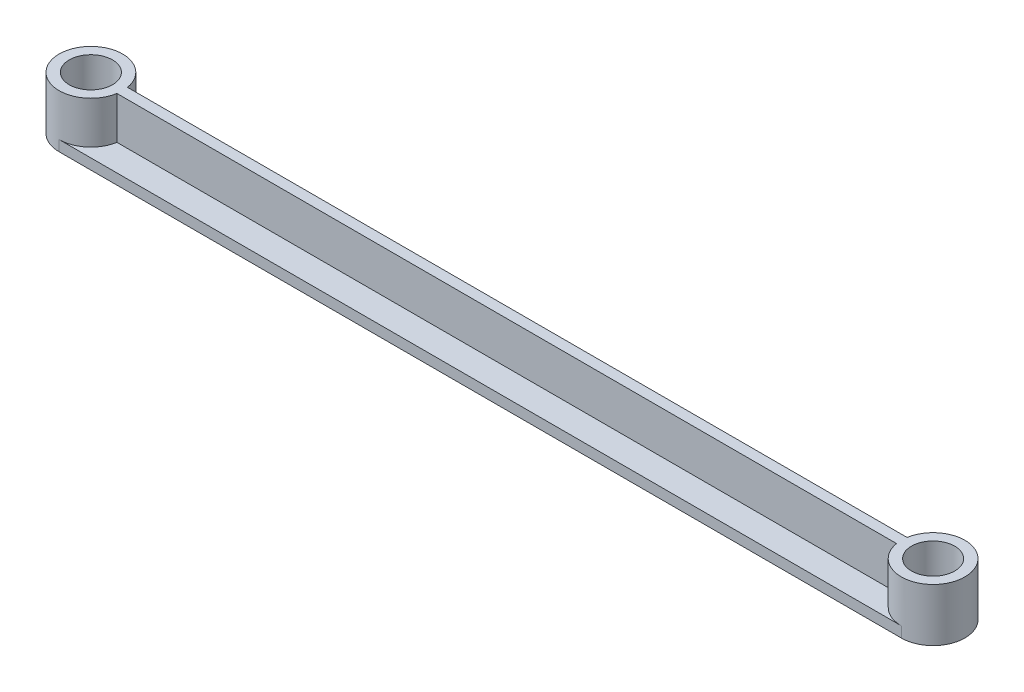
ISO-10303-21;
HEADER;
FILE_DESCRIPTION(('STEP AP214'),'2;1');
FILE_NAME('part.step','',(''),(''),'','','');
FILE_SCHEMA(('AUTOMOTIVE_DESIGN { 1 0 10303 214 1 1 1 1 }'));
ENDSEC;
DATA;
#1=APPLICATION_CONTEXT('core data for automotive mechanical design processes');
#2=APPLICATION_PROTOCOL_DEFINITION('international standard','automotive_design',2000,#1);
#3=PRODUCT_CONTEXT('',#1,'mechanical');
#4=PRODUCT('Part','Part','',(#3));
#5=PRODUCT_RELATED_PRODUCT_CATEGORY('part','',(#4));
#6=PRODUCT_DEFINITION_FORMATION('','',#4);
#7=PRODUCT_DEFINITION_CONTEXT('part definition',#1,'design');
#8=PRODUCT_DEFINITION('design','',#6,#7);
#9=PRODUCT_DEFINITION_SHAPE('','',#8);
#10=(LENGTH_UNIT() NAMED_UNIT(*) SI_UNIT(.MILLI.,.METRE.));
#11=(NAMED_UNIT(*) PLANE_ANGLE_UNIT() SI_UNIT($,.RADIAN.));
#12=(NAMED_UNIT(*) SI_UNIT($,.STERADIAN.) SOLID_ANGLE_UNIT());
#13=UNCERTAINTY_MEASURE_WITH_UNIT(LENGTH_MEASURE(1.E-05),#10,'distance_accuracy_value','');
#14=(GEOMETRIC_REPRESENTATION_CONTEXT(3) GLOBAL_UNCERTAINTY_ASSIGNED_CONTEXT((#13)) GLOBAL_UNIT_ASSIGNED_CONTEXT((#10,
#11,#12)) REPRESENTATION_CONTEXT('',''));
#15=CARTESIAN_POINT('',(0.,0.,0.));
#16=DIRECTION('',(0.,0.,1.));
#17=DIRECTION('',(1.,0.,0.));
#18=AXIS2_PLACEMENT_3D('',#15,#16,#17);
#19=CARTESIAN_POINT('',(0.,1.5875,0.));
#20=DIRECTION('',(0.,1.,0.));
#21=DIRECTION('',(0.,0.,1.));
#22=AXIS2_PLACEMENT_3D('',#19,#20,#21);
#23=PLANE('',#22);
#24=DIRECTION('',(1.,0.,0.));
#25=VECTOR('',#24,1.);
#26=CARTESIAN_POINT('',(-131.0152,1.5875,-0.793750000000001));
#27=LINE('',#26,#25);
#28=CARTESIAN_POINT('',(-121.554811672165,1.5875,-0.793750000000001));
#29=VERTEX_POINT('',#28);
#30=CARTESIAN_POINT('',(-4.69588832783533,1.5875,-0.793750000000001));
#31=VERTEX_POINT('',#30);
#32=EDGE_CURVE('E131',#29,#31,#27,.T.);
#33=ORIENTED_EDGE('',*,*,#32,.T.);
#34=CARTESIAN_POINT('',(0.,1.5875,0.));
#35=DIRECTION('',(0.,1.,0.));
#36=DIRECTION('',(0.,0.,1.));
#37=AXIS2_PLACEMENT_3D('',#34,#35,#36);
#38=CIRCLE('',#37,4.7625);
#39=CARTESIAN_POINT('',(0.,1.5875,-4.7625));
#40=VERTEX_POINT('',#39);
#41=EDGE_CURVE('E45',#31,#40,#38,.F.);
#42=ORIENTED_EDGE('',*,*,#41,.T.);
#43=DIRECTION('',(-1.,0.,0.));
#44=VECTOR('',#43,1.);
#45=CARTESIAN_POINT('',(0.,1.5875,-4.7625));
#46=LINE('',#45,#44);
#47=CARTESIAN_POINT('',(-126.2507,1.5875,-4.76249999999998));
#48=VERTEX_POINT('',#47);
#49=EDGE_CURVE('E90',#40,#48,#46,.T.);
#50=ORIENTED_EDGE('',*,*,#49,.T.);
#51=CARTESIAN_POINT('',(-126.2507,1.5875,0.));
#52=DIRECTION('',(0.,1.,0.));
#53=DIRECTION('',(0.,0.,1.));
#54=AXIS2_PLACEMENT_3D('',#51,#52,#53);
#55=CIRCLE('',#54,4.7625);
#56=EDGE_CURVE('E139',#29,#48,#55,.T.);
#57=ORIENTED_EDGE('',*,*,#56,.F.);
#58=EDGE_LOOP('',(#33,#42,#50,#57));
#59=FACE_BOUND('',#58,.T.);
#60=ADVANCED_FACE('F37',(#59),#23,.T.);
#61=CARTESIAN_POINT('',(0.,1.5875,0.));
#62=DIRECTION('',(0.,-1.,0.));
#63=DIRECTION('',(0.,0.,-1.));
#64=AXIS2_PLACEMENT_3D('',#61,#62,#63);
#65=CYLINDRICAL_SURFACE('',#64,4.7625);
#66=ORIENTED_EDGE('',*,*,#41,.F.);
#67=DIRECTION('',(0.,-1.,0.));
#68=VECTOR('',#67,1.);
#69=CARTESIAN_POINT('',(-4.69588832783533,1.5875,-0.793750000000001));
#70=LINE('',#69,#68);
#71=CARTESIAN_POINT('',(-4.69588832783533,7.9375,-0.793749999999999));
#72=VERTEX_POINT('',#71);
#73=EDGE_CURVE('E167',#31,#72,#70,.F.);
#74=ORIENTED_EDGE('',*,*,#73,.T.);
#75=CARTESIAN_POINT('',(0.,7.9375,0.));
#76=DIRECTION('',(0.,1.,0.));
#77=DIRECTION('',(0.,0.,1.));
#78=AXIS2_PLACEMENT_3D('',#75,#76,#77);
#79=CIRCLE('',#78,4.7625);
#80=CARTESIAN_POINT('',(-4.69588832783532,7.9375,0.793749999999998));
#81=VERTEX_POINT('',#80);
#82=EDGE_CURVE('E150',#81,#72,#79,.T.);
#83=ORIENTED_EDGE('',*,*,#82,.F.);
#84=DIRECTION('',(0.,-1.,0.));
#85=VECTOR('',#84,1.);
#86=CARTESIAN_POINT('',(-4.69588832783533,1.5875,0.793750000000001));
#87=LINE('',#86,#85);
#88=CARTESIAN_POINT('',(-4.69588832783533,1.5875,0.793750000000001));
#89=VERTEX_POINT('',#88);
#90=EDGE_CURVE('E52',#81,#89,#87,.T.);
#91=ORIENTED_EDGE('',*,*,#90,.T.);
#92=CARTESIAN_POINT('',(0.,1.5875,4.7625));
#93=VERTEX_POINT('',#92);
#94=EDGE_CURVE('E11',#93,#89,#38,.F.);
#95=ORIENTED_EDGE('',*,*,#94,.F.);
#96=DIRECTION('',(0.,-1.,0.));
#97=VECTOR('',#96,1.);
#98=CARTESIAN_POINT('',(0.,1.5875,4.7625));
#99=LINE('',#98,#97);
#100=CARTESIAN_POINT('',(0.,0.,4.7625));
#101=VERTEX_POINT('',#100);
#102=EDGE_CURVE('E83',#93,#101,#99,.T.);
#103=ORIENTED_EDGE('',*,*,#102,.T.);
#104=CARTESIAN_POINT('',(0.,0.,0.));
#105=DIRECTION('',(0.,1.,0.));
#106=DIRECTION('',(0.,0.,1.));
#107=AXIS2_PLACEMENT_3D('',#104,#105,#106);
#108=CIRCLE('',#107,4.7625);
#109=CARTESIAN_POINT('',(0.,0.,-4.7625));
#110=VERTEX_POINT('',#109);
#111=EDGE_CURVE('E97',#101,#110,#108,.T.);
#112=ORIENTED_EDGE('',*,*,#111,.T.);
#113=DIRECTION('',(0.,-1.,0.));
#114=VECTOR('',#113,1.);
#115=CARTESIAN_POINT('',(0.,1.5875,-4.7625));
#116=LINE('',#115,#114);
#117=EDGE_CURVE('E116',#40,#110,#116,.T.);
#118=ORIENTED_EDGE('',*,*,#117,.F.);
#119=EDGE_LOOP('',(#66,#74,#83,#91,#95,#103,#112,#118));
#120=FACE_BOUND('',#119,.T.);
#121=ADVANCED_FACE('F39',(#120),#65,.T.);
#122=CARTESIAN_POINT('',(0.,1.5875,-4.7625));
#123=DIRECTION('',(0.,0.,1.));
#124=DIRECTION('',(1.,0.,0.));
#125=AXIS2_PLACEMENT_3D('',#122,#123,#124);
#126=PLANE('',#125);
#127=DIRECTION('',(-1.,0.,0.));
#128=VECTOR('',#127,1.);
#129=CARTESIAN_POINT('',(0.,0.,-4.7625));
#130=LINE('',#129,#128);
#131=CARTESIAN_POINT('',(-126.2507,0.,-4.76249999999998));
#132=VERTEX_POINT('',#131);
#133=EDGE_CURVE('E100',#110,#132,#130,.T.);
#134=ORIENTED_EDGE('',*,*,#133,.T.);
#135=DIRECTION('',(0.,-1.,0.));
#136=VECTOR('',#135,1.);
#137=CARTESIAN_POINT('',(-126.2507,1.5875,-4.76249999999998));
#138=LINE('',#137,#136);
#139=EDGE_CURVE('E113',#48,#132,#138,.T.);
#140=ORIENTED_EDGE('',*,*,#139,.F.);
#141=ORIENTED_EDGE('',*,*,#49,.F.);
#142=ORIENTED_EDGE('',*,*,#117,.T.);
#143=EDGE_LOOP('',(#134,#140,#141,#142));
#144=FACE_BOUND('',#143,.T.);
#145=ADVANCED_FACE('F136',(#144),#126,.F.);
#146=CARTESIAN_POINT('',(-126.2507,1.5875,0.));
#147=DIRECTION('',(0.,-1.,0.));
#148=DIRECTION('',(0.,0.,-1.));
#149=AXIS2_PLACEMENT_3D('',#146,#147,#148);
#150=CYLINDRICAL_SURFACE('',#149,4.7625);
#151=CARTESIAN_POINT('',(-126.2507,7.9375,0.));
#152=DIRECTION('',(0.,1.,0.));
#153=DIRECTION('',(0.,0.,1.));
#154=AXIS2_PLACEMENT_3D('',#151,#152,#153);
#155=CIRCLE('',#154,4.7625);
#156=CARTESIAN_POINT('',(-121.554811672165,7.9375,-0.79375));
#157=VERTEX_POINT('',#156);
#158=CARTESIAN_POINT('',(-121.554811672165,7.9375,0.79375));
#159=VERTEX_POINT('',#158);
#160=EDGE_CURVE('E102',#157,#159,#155,.T.);
#161=ORIENTED_EDGE('',*,*,#160,.F.);
#162=DIRECTION('',(0.,-1.,0.));
#163=VECTOR('',#162,1.);
#164=CARTESIAN_POINT('',(-121.554811672165,1.5875,-0.793750000000001));
#165=LINE('',#164,#163);
#166=EDGE_CURVE('E156',#29,#157,#165,.F.);
#167=ORIENTED_EDGE('',*,*,#166,.F.);
#168=ORIENTED_EDGE('',*,*,#56,.T.);
#169=ORIENTED_EDGE('',*,*,#139,.T.);
#170=CARTESIAN_POINT('',(-126.2507,0.,0.));
#171=DIRECTION('',(0.,1.,0.));
#172=DIRECTION('',(0.,0.,1.));
#173=AXIS2_PLACEMENT_3D('',#170,#171,#172);
#174=CIRCLE('',#173,4.7625);
#175=CARTESIAN_POINT('',(-126.2507,0.,4.76250000000002));
#176=VERTEX_POINT('',#175);
#177=EDGE_CURVE('E91',#132,#176,#174,.T.);
#178=ORIENTED_EDGE('',*,*,#177,.T.);
#179=DIRECTION('',(0.,-1.,0.));
#180=VECTOR('',#179,1.);
#181=CARTESIAN_POINT('',(-126.2507,1.5875,4.76250000000002));
#182=LINE('',#181,#180);
#183=CARTESIAN_POINT('',(-126.2507,1.5875,4.76250000000001));
#184=VERTEX_POINT('',#183);
#185=EDGE_CURVE('E86',#184,#176,#182,.T.);
#186=ORIENTED_EDGE('',*,*,#185,.F.);
#187=CARTESIAN_POINT('',(-121.554811672165,1.5875,0.793750000000001));
#188=VERTEX_POINT('',#187);
#189=EDGE_CURVE('E106',#184,#188,#55,.T.);
#190=ORIENTED_EDGE('',*,*,#189,.T.);
#191=DIRECTION('',(0.,-1.,0.));
#192=VECTOR('',#191,1.);
#193=CARTESIAN_POINT('',(-121.554811672165,1.5875,0.793750000000001));
#194=LINE('',#193,#192);
#195=EDGE_CURVE('E164',#159,#188,#194,.T.);
#196=ORIENTED_EDGE('',*,*,#195,.F.);
#197=EDGE_LOOP('',(#161,#167,#168,#169,#178,#186,#190,#196));
#198=FACE_BOUND('',#197,.T.);
#199=ADVANCED_FACE('F180',(#198),#150,.T.);
#200=CARTESIAN_POINT('',(0.,1.5875,4.7625));
#201=DIRECTION('',(0.,0.,-1.));
#202=DIRECTION('',(-1.,0.,0.));
#203=AXIS2_PLACEMENT_3D('',#200,#201,#202);
#204=PLANE('',#203);
#205=DIRECTION('',(1.,0.,0.));
#206=VECTOR('',#205,1.);
#207=CARTESIAN_POINT('',(0.,0.,4.7625));
#208=LINE('',#207,#206);
#209=EDGE_CURVE('E80',#176,#101,#208,.T.);
#210=ORIENTED_EDGE('',*,*,#209,.T.);
#211=ORIENTED_EDGE('',*,*,#102,.F.);
#212=DIRECTION('',(1.,0.,0.));
#213=VECTOR('',#212,1.);
#214=CARTESIAN_POINT('',(0.,1.5875,4.7625));
#215=LINE('',#214,#213);
#216=EDGE_CURVE('E60',#184,#93,#215,.T.);
#217=ORIENTED_EDGE('',*,*,#216,.F.);
#218=ORIENTED_EDGE('',*,*,#185,.T.);
#219=EDGE_LOOP('',(#210,#211,#217,#218));
#220=FACE_BOUND('',#219,.T.);
#221=ADVANCED_FACE('F82',(#220),#204,.F.);
#222=DIRECTION('',(1.,0.,0.));
#223=VECTOR('',#222,1.);
#224=CARTESIAN_POINT('',(-131.0152,1.5875,0.793750000000001));
#225=LINE('',#224,#223);
#226=EDGE_CURVE('E154',#188,#89,#225,.T.);
#227=ORIENTED_EDGE('',*,*,#226,.F.);
#228=ORIENTED_EDGE('',*,*,#189,.F.);
#229=ORIENTED_EDGE('',*,*,#216,.T.);
#230=ORIENTED_EDGE('',*,*,#94,.T.);
#231=EDGE_LOOP('',(#227,#228,#229,#230));
#232=FACE_BOUND('',#231,.T.);
#233=ADVANCED_FACE('F174',(#232),#23,.T.);
#234=CARTESIAN_POINT('',(0.,0.,0.));
#235=DIRECTION('',(0.,1.,0.));
#236=DIRECTION('',(0.,0.,1.));
#237=AXIS2_PLACEMENT_3D('',#234,#235,#236);
#238=PLANE('',#237);
#239=ORIENTED_EDGE('',*,*,#111,.F.);
#240=ORIENTED_EDGE('',*,*,#209,.F.);
#241=ORIENTED_EDGE('',*,*,#177,.F.);
#242=ORIENTED_EDGE('',*,*,#133,.F.);
#243=EDGE_LOOP('',(#239,#240,#241,#242));
#244=FACE_BOUND('',#243,.T.);
#245=ADVANCED_FACE('F99',(#244),#238,.F.);
#246=CARTESIAN_POINT('',(-126.2507,7.9375,0.));
#247=DIRECTION('',(0.,1.,0.));
#248=DIRECTION('',(0.,0.,1.));
#249=AXIS2_PLACEMENT_3D('',#246,#247,#248);
#250=PLANE('',#249);
#251=ORIENTED_EDGE('',*,*,#160,.T.);
#252=DIRECTION('',(1.,0.,0.));
#253=VECTOR('',#252,1.);
#254=CARTESIAN_POINT('',(-131.0152,7.9375,0.79375));
#255=LINE('',#254,#253);
#256=EDGE_CURVE('E153',#159,#81,#255,.T.);
#257=ORIENTED_EDGE('',*,*,#256,.T.);
#258=ORIENTED_EDGE('',*,*,#82,.T.);
#259=DIRECTION('',(1.,0.,0.));
#260=VECTOR('',#259,1.);
#261=CARTESIAN_POINT('',(-131.0152,7.9375,-0.79375));
#262=LINE('',#261,#260);
#263=EDGE_CURVE('E158',#157,#72,#262,.T.);
#264=ORIENTED_EDGE('',*,*,#263,.F.);
#265=EDGE_LOOP('',(#251,#257,#258,#264));
#266=FACE_BOUND('',#265,.T.);
#267=CARTESIAN_POINT('',(-126.2507,7.9375,0.));
#268=DIRECTION('',(0.,1.,0.));
#269=DIRECTION('',(0.,0.,1.));
#270=AXIS2_PLACEMENT_3D('',#267,#268,#269);
#271=CIRCLE('',#270,3.23850000000001);
#272=CARTESIAN_POINT('',(-126.2507,7.9375,3.23850000000002));
#273=VERTEX_POINT('',#272);
#274=EDGE_CURVE('E144',#273,#273,#271,.T.);
#275=ORIENTED_EDGE('',*,*,#274,.F.);
#276=EDGE_LOOP('',(#275));
#277=FACE_BOUND('',#276,.T.);
#278=CARTESIAN_POINT('',(0.,7.9375,0.));
#279=DIRECTION('',(0.,1.,0.));
#280=DIRECTION('',(0.,0.,1.));
#281=AXIS2_PLACEMENT_3D('',#278,#279,#280);
#282=CIRCLE('',#281,3.2385);
#283=CARTESIAN_POINT('',(0.,7.9375,3.2385));
#284=VERTEX_POINT('',#283);
#285=EDGE_CURVE('E145',#284,#284,#282,.T.);
#286=ORIENTED_EDGE('',*,*,#285,.F.);
#287=EDGE_LOOP('',(#286));
#288=FACE_BOUND('',#287,.T.);
#289=ADVANCED_FACE('F194',(#266,#277,#288),#250,.T.);
#290=CARTESIAN_POINT('',(-126.2507,7.9375,0.));
#291=DIRECTION('',(0.,-1.,0.));
#292=DIRECTION('',(0.,0.,-1.));
#293=AXIS2_PLACEMENT_3D('',#290,#291,#292);
#294=CYLINDRICAL_SURFACE('',#293,3.23850000000001);
#295=ORIENTED_EDGE('',*,*,#274,.T.);
#296=EDGE_LOOP('',(#295));
#297=FACE_BOUND('',#296,.T.);
#298=CARTESIAN_POINT('',(-126.2507,1.5875,0.));
#299=DIRECTION('',(0.,1.,0.));
#300=DIRECTION('',(0.,0.,1.));
#301=AXIS2_PLACEMENT_3D('',#298,#299,#300);
#302=CIRCLE('',#301,3.23850000000001);
#303=CARTESIAN_POINT('',(-126.2507,1.5875,3.23850000000002));
#304=VERTEX_POINT('',#303);
#305=EDGE_CURVE('E141',#304,#304,#302,.T.);
#306=ORIENTED_EDGE('',*,*,#305,.F.);
#307=EDGE_LOOP('',(#306));
#308=FACE_BOUND('',#307,.T.);
#309=ADVANCED_FACE('F223',(#297,#308),#294,.F.);
#310=ORIENTED_EDGE('',*,*,#305,.T.);
#311=EDGE_LOOP('',(#310));
#312=FACE_BOUND('',#311,.T.);
#313=ADVANCED_FACE('F209',(#312),#23,.T.);
#314=CARTESIAN_POINT('',(0.,7.9375,0.));
#315=DIRECTION('',(0.,-1.,0.));
#316=DIRECTION('',(0.,0.,-1.));
#317=AXIS2_PLACEMENT_3D('',#314,#315,#316);
#318=CYLINDRICAL_SURFACE('',#317,3.2385);
#319=ORIENTED_EDGE('',*,*,#285,.T.);
#320=EDGE_LOOP('',(#319));
#321=FACE_BOUND('',#320,.T.);
#322=CARTESIAN_POINT('',(0.,1.5875,0.));
#323=DIRECTION('',(0.,1.,0.));
#324=DIRECTION('',(0.,0.,1.));
#325=AXIS2_PLACEMENT_3D('',#322,#323,#324);
#326=CIRCLE('',#325,3.2385);
#327=CARTESIAN_POINT('',(0.,1.5875,3.2385));
#328=VERTEX_POINT('',#327);
#329=EDGE_CURVE('E117',#328,#328,#326,.F.);
#330=ORIENTED_EDGE('',*,*,#329,.T.);
#331=EDGE_LOOP('',(#330));
#332=FACE_BOUND('',#331,.T.);
#333=ADVANCED_FACE('F206',(#321,#332),#318,.F.);
#334=ORIENTED_EDGE('',*,*,#329,.F.);
#335=EDGE_LOOP('',(#334));
#336=FACE_BOUND('',#335,.T.);
#337=ADVANCED_FACE('F199',(#336),#23,.T.);
#338=CARTESIAN_POINT('',(-131.0152,7.9375,-0.79375));
#339=DIRECTION('',(0.,0.,-1.));
#340=DIRECTION('',(0.,1.,0.));
#341=AXIS2_PLACEMENT_3D('',#338,#339,#340);
#342=PLANE('',#341);
#343=ORIENTED_EDGE('',*,*,#32,.F.);
#344=ORIENTED_EDGE('',*,*,#166,.T.);
#345=ORIENTED_EDGE('',*,*,#263,.T.);
#346=ORIENTED_EDGE('',*,*,#73,.F.);
#347=EDGE_LOOP('',(#343,#344,#345,#346));
#348=FACE_BOUND('',#347,.T.);
#349=ADVANCED_FACE('F191',(#348),#342,.T.);
#350=CARTESIAN_POINT('',(-131.0152,7.9375,0.79375));
#351=DIRECTION('',(0.,0.,1.));
#352=DIRECTION('',(0.,-1.,0.));
#353=AXIS2_PLACEMENT_3D('',#350,#351,#352);
#354=PLANE('',#353);
#355=ORIENTED_EDGE('',*,*,#256,.F.);
#356=ORIENTED_EDGE('',*,*,#195,.T.);
#357=ORIENTED_EDGE('',*,*,#226,.T.);
#358=ORIENTED_EDGE('',*,*,#90,.F.);
#359=EDGE_LOOP('',(#355,#356,#357,#358));
#360=FACE_BOUND('',#359,.T.);
#361=ADVANCED_FACE('F196',(#360),#354,.T.);
#362=CLOSED_SHELL('',(#60,#121,#145,#199,#221,#233,#245,#289,#309,#313,#333,#337,#349,#361));
#363=MANIFOLD_SOLID_BREP('B2',#362);
#364=ADVANCED_BREP_SHAPE_REPRESENTATION('',(#18,#363),#14);
#365=SHAPE_DEFINITION_REPRESENTATION(#9,#364);
ENDSEC;
END-ISO-10303-21;
